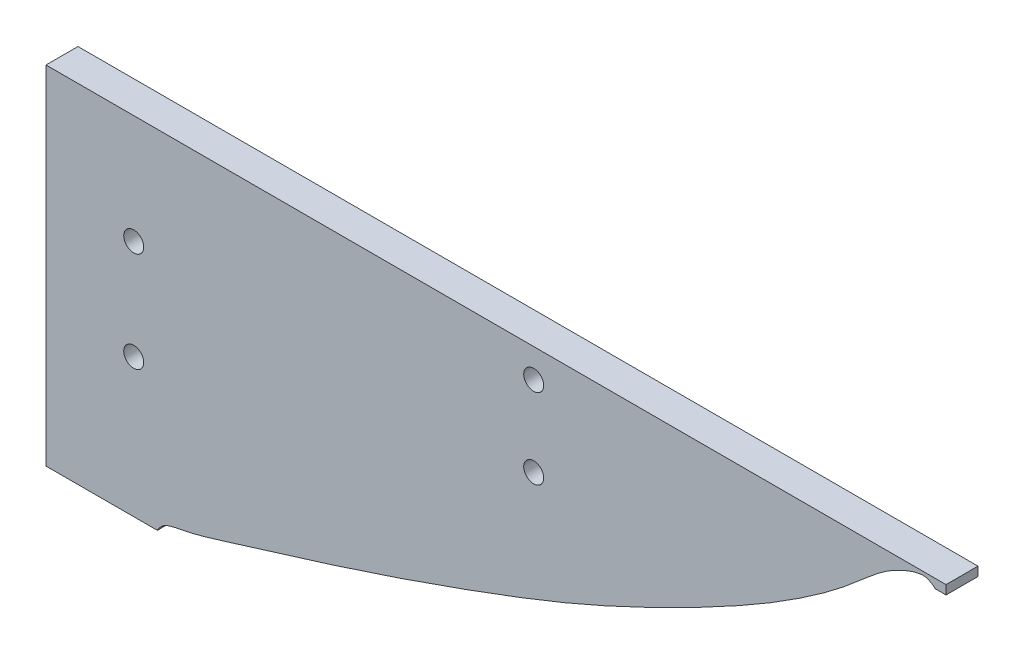
ISO-10303-21;
HEADER;
FILE_DESCRIPTION(('STEP AP214'),'2;1');
FILE_NAME('part.step','',(''),(''),'','','');
FILE_SCHEMA(('AUTOMOTIVE_DESIGN { 1 0 10303 214 1 1 1 1 }'));
ENDSEC;
DATA;
#1=APPLICATION_CONTEXT('core data for automotive mechanical design processes');
#2=APPLICATION_PROTOCOL_DEFINITION('international standard','automotive_design',2000,#1);
#3=PRODUCT_CONTEXT('',#1,'mechanical');
#4=PRODUCT('Part','Part','',(#3));
#5=PRODUCT_RELATED_PRODUCT_CATEGORY('part','',(#4));
#6=PRODUCT_DEFINITION_FORMATION('','',#4);
#7=PRODUCT_DEFINITION_CONTEXT('part definition',#1,'design');
#8=PRODUCT_DEFINITION('design','',#6,#7);
#9=PRODUCT_DEFINITION_SHAPE('','',#8);
#10=(LENGTH_UNIT() NAMED_UNIT(*) SI_UNIT(.MILLI.,.METRE.));
#11=(NAMED_UNIT(*) PLANE_ANGLE_UNIT() SI_UNIT($,.RADIAN.));
#12=(NAMED_UNIT(*) SI_UNIT($,.STERADIAN.) SOLID_ANGLE_UNIT());
#13=UNCERTAINTY_MEASURE_WITH_UNIT(LENGTH_MEASURE(1.E-05),#10,'distance_accuracy_value','');
#14=(GEOMETRIC_REPRESENTATION_CONTEXT(3) GLOBAL_UNCERTAINTY_ASSIGNED_CONTEXT((#13)) GLOBAL_UNIT_ASSIGNED_CONTEXT((#10,
#11,#12)) REPRESENTATION_CONTEXT('',''));
#15=CARTESIAN_POINT('',(0.,0.,0.));
#16=DIRECTION('',(0.,0.,1.));
#17=DIRECTION('',(1.,0.,0.));
#18=AXIS2_PLACEMENT_3D('',#15,#16,#17);
#19=CARTESIAN_POINT('',(7.2328128752797,-49.6204335958696,180.));
#20=DIRECTION('',(0.,0.,-1.));
#21=DIRECTION('',(-1.,0.,0.));
#22=AXIS2_PLACEMENT_3D('',#19,#20,#21);
#23=PLANE('',#22);
#24=CARTESIAN_POINT('',(-100.,-50.,180.));
#25=DIRECTION('',(0.,0.,-1.));
#26=DIRECTION('',(-1.,0.,0.));
#27=AXIS2_PLACEMENT_3D('',#24,#25,#26);
#28=CIRCLE('',#27,2.5);
#29=CARTESIAN_POINT('',(-102.5,-50.,180.));
#30=VERTEX_POINT('',#29);
#31=EDGE_CURVE('E242',#30,#30,#28,.F.);
#32=ORIENTED_EDGE('',*,*,#31,.F.);
#33=EDGE_LOOP('',(#32));
#34=FACE_BOUND('',#33,.T.);
#35=CARTESIAN_POINT('',(0.0705666698621599,-4.96037406111782,180.));
#36=DIRECTION('',(0.,0.,-1.));
#37=DIRECTION('',(-1.,0.,0.));
#38=AXIS2_PLACEMENT_3D('',#35,#36,#37);
#39=CIRCLE('',#38,2.5);
#40=CARTESIAN_POINT('',(-2.42943333013784,-4.96037406111782,180.));
#41=VERTEX_POINT('',#40);
#42=EDGE_CURVE('E238',#41,#41,#39,.F.);
#43=ORIENTED_EDGE('',*,*,#42,.F.);
#44=EDGE_LOOP('',(#43));
#45=FACE_BOUND('',#44,.T.);
#46=CARTESIAN_POINT('',(100.471154282561,0.,180.));
#47=CARTESIAN_POINT('',(100.408054989966,0.129786807460161,180.));
#48=CARTESIAN_POINT('',(100.304703862858,0.232658057293413,180.));
#49=CARTESIAN_POINT('',(100.076584896166,0.4071234126981,180.));
#50=CARTESIAN_POINT('',(99.955243878758,0.483033039062654,180.));
#51=CARTESIAN_POINT('',(99.5929613615913,0.713468513721508,180.));
#52=CARTESIAN_POINT('',(99.3565828385596,0.875395057017679,180.));
#53=CARTESIAN_POINT('',(98.9772983778677,1.07892448132871,180.));
#54=CARTESIAN_POINT('',(98.8489147478321,1.14113823304883,180.));
#55=CARTESIAN_POINT('',(98.5847551683284,1.24428486320763,180.));
#56=CARTESIAN_POINT('',(98.4486465612403,1.28426009300552,180.));
#57=CARTESIAN_POINT('',(98.1691424192041,1.3432330786417,180.));
#58=CARTESIAN_POINT('',(98.0254111419077,1.36218231291401,180.));
#59=CARTESIAN_POINT('',(97.7408322973029,1.38234815483863,180.));
#60=CARTESIAN_POINT('',(97.5987598937451,1.38390399845911,180.));
#61=CARTESIAN_POINT('',(97.1730026614788,1.37049810682273,180.));
#62=CARTESIAN_POINT('',(96.8890067855004,1.33789692513515,180.));
#63=CARTESIAN_POINT('',(96.3250278798241,1.24739222228476,180.));
#64=CARTESIAN_POINT('',(96.0468201136647,1.1907451766166,180.));
#65=CARTESIAN_POINT('',(95.2219441777138,0.991434019008236,180.));
#66=CARTESIAN_POINT('',(94.6850579931911,0.819295563819661,180.));
#67=CARTESIAN_POINT('',(93.6233729693174,0.438597972899097,180.));
#68=CARTESIAN_POINT('',(93.0989229397729,0.228987829659148,180.));
#69=CARTESIAN_POINT('',(92.0615489992294,-0.224962091450086,180.));
#70=CARTESIAN_POINT('',(91.5483920483561,-0.468842082657131,180.));
#71=CARTESIAN_POINT('',(90.0419946142921,-1.23849097037649,180.));
#72=CARTESIAN_POINT('',(89.0763803293101,-1.80641963291992,180.));
#73=CARTESIAN_POINT('',(86.2912598242061,-3.66869368024866,180.));
#74=CARTESIAN_POINT('',(84.5772601575338,-5.11270946639362,180.));
#75=CARTESIAN_POINT('',(82.0309498511078,-7.31375695590436,180.));
#76=CARTESIAN_POINT('',(81.1853587369474,-8.05191488591583,180.));
#77=CARTESIAN_POINT('',(79.4790942987835,-9.50728163414145,180.));
#78=CARTESIAN_POINT('',(78.6200516410328,-10.2267791545117,180.));
#79=CARTESIAN_POINT('',(76.0117437135278,-12.3420880266422,180.));
#80=CARTESIAN_POINT('',(74.2293380194322,-13.6920004727839,180.));
#81=CARTESIAN_POINT('',(70.6062901645955,-16.3111688816568,180.));
#82=CARTESIAN_POINT('',(68.7660169614089,-17.5809358441202,180.));
#83=CARTESIAN_POINT('',(65.0420901554389,-20.0603886775598,180.));
#84=CARTESIAN_POINT('',(63.1579344331396,-21.2693791218259,180.));
#85=CARTESIAN_POINT('',(59.3461673564658,-23.6271747232094,180.));
#86=CARTESIAN_POINT('',(57.4197963877762,-24.7760783433428,180.));
#87=CARTESIAN_POINT('',(53.5401373919744,-27.0222807082155,180.));
#88=CARTESIAN_POINT('',(51.5859874588674,-28.1203649533307,180.));
#89=CARTESIAN_POINT('',(47.657149873805,-30.2806552863859,180.));
#90=CARTESIAN_POINT('',(45.682458088426,-31.3425762915052,180.));
#91=CARTESIAN_POINT('',(39.7346969865076,-34.4813945359658,180.));
#92=CARTESIAN_POINT('',(35.7363617414028,-36.512375418543,180.));
#93=CARTESIAN_POINT('',(27.6908038011899,-40.4688908739496,180.));
#94=CARTESIAN_POINT('',(23.6441059135639,-42.3959913311034,180.));
#95=CARTESIAN_POINT('',(15.4881099440041,-46.1163042852202,180.));
#96=CARTESIAN_POINT('',(11.3753694528412,-47.9061545383723,180.));
#97=CARTESIAN_POINT('',(3.09025629771827,-51.3347126533668,180.));
#98=CARTESIAN_POINT('',(-1.08136488064514,-52.9747623150191,180.));
#99=CARTESIAN_POINT('',(-9.4609099422426,-56.1621465217994,180.));
#100=CARTESIAN_POINT('',(-13.6680302693022,-57.7125997116731,180.));
#101=CARTESIAN_POINT('',(-22.1012033469257,-60.7591772154073,180.));
#102=CARTESIAN_POINT('',(-26.3276307564415,-62.2542808069109,180.));
#103=CARTESIAN_POINT('',(-34.8042337083704,-65.1764711493172,180.));
#104=CARTESIAN_POINT('',(-39.0551043639137,-66.6023736970143,180.));
#105=CARTESIAN_POINT('',(-47.5789941904856,-69.3864604965142,180.));
#106=CARTESIAN_POINT('',(-51.8518111419422,-70.7450157431269,180.));
#107=CARTESIAN_POINT('',(-60.4085194334344,-73.4269103375464,180.));
#108=CARTESIAN_POINT('',(-64.6918750502564,-74.7518873893612,180.));
#109=CARTESIAN_POINT('',(-71.1184517978404,-76.73424365909,180.));
#110=CARTESIAN_POINT('',(-73.2612701975019,-77.3930178666579,180.));
#111=CARTESIAN_POINT('',(-76.4779836131185,-78.3730026260492,180.));
#112=CARTESIAN_POINT('',(-77.5506380800318,-78.6982948943509,180.));
#113=CARTESIAN_POINT('',(-79.6968114271097,-79.3460386209079,180.));
#114=CARTESIAN_POINT('',(-80.769513999295,-79.6714321673382,180.));
#115=CARTESIAN_POINT('',(-82.9205019863126,-80.3012880673793,180.));
#116=CARTESIAN_POINT('',(-83.9997156409739,-80.6023222019746,180.));
#117=CARTESIAN_POINT('',(-85.6319441459041,-81.0037912624357,180.));
#118=CARTESIAN_POINT('',(-86.1781706356875,-81.1295823225719,180.));
#119=CARTESIAN_POINT('',(-87.2752949983577,-81.3637157205127,180.));
#120=CARTESIAN_POINT('',(-87.827035995892,-81.4689087880605,180.));
#121=CARTESIAN_POINT('',(-88.9321122397858,-81.6733400261882,180.));
#122=CARTESIAN_POINT('',(-89.4843579407671,-81.7766479068202,180.));
#123=CARTESIAN_POINT('',(-90.3027247539308,-81.9689685893107,180.));
#124=CARTESIAN_POINT('',(-90.5738949335214,-82.0391219285039,180.));
#125=CARTESIAN_POINT('',(-91.1110894439908,-82.1986495706477,180.));
#126=CARTESIAN_POINT('',(-91.3770176069542,-82.2883830835406,180.));
#127=CARTESIAN_POINT('',(-91.7686340026207,-82.4501603713897,180.));
#128=CARTESIAN_POINT('',(-91.897952841729,-82.5086429714949,180.));
#129=CARTESIAN_POINT('',(-92.1534046565608,-82.6375081260353,180.));
#130=CARTESIAN_POINT('',(-92.2802782151257,-82.7084411698767,180.));
#131=CARTESIAN_POINT('',(-92.6438878550964,-82.9369543209383,180.));
#132=CARTESIAN_POINT('',(-92.8635563115861,-83.1144408750309,180.));
#133=CARTESIAN_POINT('',(-93.272689854053,-83.5028139409378,180.));
#134=CARTESIAN_POINT('',(-93.4598417659297,-83.7162584426666,180.));
#135=CARTESIAN_POINT('',(-93.7370652801272,-84.0403004337075,180.));
#136=CARTESIAN_POINT('',(-93.828685813648,-84.150040339622,180.));
#137=CARTESIAN_POINT('',(-93.9908942706409,-84.3839154654659,180.));
#138=CARTESIAN_POINT('',(-94.0605798141769,-84.5106716424073,180.));
#139=CARTESIAN_POINT('',(-94.0885523707614,-84.6514513068922,180.));
#140=B_SPLINE_CURVE_WITH_KNOTS('',3,(#46,#47,#48,#49,#50,#51,#52,#53,#54,#55,#56,#57,#58,#59,
#60,#61,#62,#63,#64,#65,#66,#67,#68,#69,#70,#71,#72,#73,#74,#75,#76,#77,#78,#79,#80,#81,#82,#83,
#84,#85,#86,#87,#88,#89,#90,#91,#92,#93,#94,#95,#96,#97,#98,#99,#100,#101,#102,#103,#104,#105,
#106,#107,#108,#109,#110,#111,#112,#113,#114,#115,#116,#117,#118,#119,#120,#121,#122,#123,#124,
#125,#126,#127,#128,#129,#130,#131,#132,#133,#134,#135,#136,#137,#138,#139),.UNSPECIFIED.,.F.,
.F.,(4,2,2,2,2,2,2,2,2,2,2,2,2,2,2,2,2,2,2,2,2,2,2,2,2,2,2,2,2,2,2,2,2,2,2,2,2,2,2,2,2,2,2,2,2,
2,4),(0.,0.001953125,0.00390625,0.00781249999999989,0.00976562499999978,0.0117187499999998,
0.0136718749999997,0.0156249999999997,0.0195312499999994,0.0234374999999993,0.0312499999999993,
0.0390624999999992,0.0468749999999991,0.0624999999999991,0.0937499999999991,0.109374999999999,
0.124999999999999,0.156249999999999,0.187499999999999,0.218749999999999,0.249999999999999,
0.281249999999999,0.312499999999999,0.375,0.4375,0.5,0.5625,0.625,0.6875,0.75,0.812500000000001,
0.875000000000001,0.906250000000001,0.921875000000001,0.937500000000001,0.953125000000001,
0.960937500000001,0.968750000000001,0.976562500000001,0.980468750000001,0.984375000000001,
0.986328125000001,0.988281250000001,0.992187500000001,0.99609375,0.998046875,1.),.UNSPECIFIED.);
#141=CARTESIAN_POINT('',(-94.0885523707615,-84.6514513068921,180.));
#142=VERTEX_POINT('',#141);
#143=CARTESIAN_POINT('',(100.471154282561,0.,180.));
#144=VERTEX_POINT('',#143);
#145=EDGE_CURVE('E196',#142,#144,#140,.F.);
#146=ORIENTED_EDGE('',*,*,#145,.T.);
#147=DIRECTION('',(1.,0.,0.));
#148=VECTOR('',#147,1.);
#149=CARTESIAN_POINT('',(100.471154282561,0.,180.));
#150=LINE('',#149,#148);
#151=CARTESIAN_POINT('',(103.229198754891,0.,180.));
#152=VERTEX_POINT('',#151);
#153=EDGE_CURVE('E90',#144,#152,#150,.T.);
#154=ORIENTED_EDGE('',*,*,#153,.T.);
#155=DIRECTION('',(0.,1.,0.));
#156=VECTOR('',#155,1.);
#157=CARTESIAN_POINT('',(103.229198754891,2.25600000000004,180.));
#158=LINE('',#157,#156);
#159=CARTESIAN_POINT('',(103.229198754891,2.25600000000004,180.));
#160=VERTEX_POINT('',#159);
#161=EDGE_CURVE('E103',#152,#160,#158,.T.);
#162=ORIENTED_EDGE('',*,*,#161,.T.);
#163=DIRECTION('',(-1.,0.,0.));
#164=VECTOR('',#163,1.);
#165=CARTESIAN_POINT('',(103.229198754891,2.25600000000004,180.));
#166=LINE('',#165,#164);
#167=CARTESIAN_POINT('',(-121.944823149517,2.25600000000001,180.));
#168=VERTEX_POINT('',#167);
#169=EDGE_CURVE('E97',#160,#168,#166,.T.);
#170=ORIENTED_EDGE('',*,*,#169,.T.);
#171=DIRECTION('',(0.,-1.,0.));
#172=VECTOR('',#171,1.);
#173=CARTESIAN_POINT('',(-121.944823149517,-84.6632227375932,180.));
#174=LINE('',#173,#172);
#175=CARTESIAN_POINT('',(-121.944823149517,-84.6632227375932,180.));
#176=VERTEX_POINT('',#175);
#177=EDGE_CURVE('E101',#168,#176,#174,.T.);
#178=ORIENTED_EDGE('',*,*,#177,.T.);
#179=CARTESIAN_POINT('',(-94.0885523707615,-84.6514513068921,180.));
#180=CARTESIAN_POINT('',(-103.373975083764,-84.6570848734655,180.));
#181=CARTESIAN_POINT('',(-112.659399026711,-84.6608656587816,180.));
#182=CARTESIAN_POINT('',(-121.944823149517,-84.6632227375932,180.));
#183=B_SPLINE_CURVE_WITH_KNOTS('',3,(#179,#180,#181,#182),.UNSPECIFIED.,.F.,.F.,(4,4),(0.,1.),.UNSPECIFIED.);
#184=EDGE_CURVE('E51',#176,#142,#183,.F.);
#185=ORIENTED_EDGE('',*,*,#184,.T.);
#186=EDGE_LOOP('',(#146,#154,#162,#170,#178,#185));
#187=FACE_BOUND('',#186,.T.);
#188=CARTESIAN_POINT('',(0.0705666698621599,-25.,180.));
#189=DIRECTION('',(0.,0.,-1.));
#190=DIRECTION('',(-1.,0.,0.));
#191=AXIS2_PLACEMENT_3D('',#188,#189,#190);
#192=CIRCLE('',#191,2.5);
#193=CARTESIAN_POINT('',(-2.42943333013784,-25.,180.));
#194=VERTEX_POINT('',#193);
#195=EDGE_CURVE('E239',#194,#194,#192,.F.);
#196=ORIENTED_EDGE('',*,*,#195,.F.);
#197=EDGE_LOOP('',(#196));
#198=FACE_BOUND('',#197,.T.);
#199=CARTESIAN_POINT('',(-100.,-25.,180.));
#200=DIRECTION('',(0.,0.,-1.));
#201=DIRECTION('',(-1.,0.,0.));
#202=AXIS2_PLACEMENT_3D('',#199,#200,#201);
#203=CIRCLE('',#202,2.5);
#204=CARTESIAN_POINT('',(-102.5,-25.,180.));
#205=VERTEX_POINT('',#204);
#206=EDGE_CURVE('E245',#205,#205,#203,.F.);
#207=ORIENTED_EDGE('',*,*,#206,.F.);
#208=EDGE_LOOP('',(#207));
#209=FACE_BOUND('',#208,.T.);
#210=ADVANCED_FACE('F30',(#34,#45,#187,#198,#209),#23,.F.);
#211=CARTESIAN_POINT('',(7.2328128752797,-49.6204335958696,172.));
#212=DIRECTION('',(0.,0.,-1.));
#213=DIRECTION('',(-1.,0.,0.));
#214=AXIS2_PLACEMENT_3D('',#211,#212,#213);
#215=PLANE('',#214);
#216=CARTESIAN_POINT('',(-100.,-50.,172.));
#217=DIRECTION('',(0.,0.,-1.));
#218=DIRECTION('',(-1.,0.,0.));
#219=AXIS2_PLACEMENT_3D('',#216,#217,#218);
#220=CIRCLE('',#219,2.5);
#221=CARTESIAN_POINT('',(-102.5,-50.,172.));
#222=VERTEX_POINT('',#221);
#223=EDGE_CURVE('E243',#222,#222,#220,.F.);
#224=ORIENTED_EDGE('',*,*,#223,.T.);
#225=EDGE_LOOP('',(#224));
#226=FACE_BOUND('',#225,.T.);
#227=CARTESIAN_POINT('',(0.0705666698621599,-4.96037406111782,172.));
#228=DIRECTION('',(0.,0.,-1.));
#229=DIRECTION('',(-1.,0.,0.));
#230=AXIS2_PLACEMENT_3D('',#227,#228,#229);
#231=CIRCLE('',#230,2.5);
#232=CARTESIAN_POINT('',(-2.42943333013784,-4.96037406111782,172.));
#233=VERTEX_POINT('',#232);
#234=EDGE_CURVE('E235',#233,#233,#231,.F.);
#235=ORIENTED_EDGE('',*,*,#234,.T.);
#236=EDGE_LOOP('',(#235));
#237=FACE_BOUND('',#236,.T.);
#238=CARTESIAN_POINT('',(-94.0885523707614,-84.6514513068922,172.));
#239=CARTESIAN_POINT('',(-94.0605798141769,-84.5106716424073,172.));
#240=CARTESIAN_POINT('',(-93.9908942706409,-84.3839154654659,172.));
#241=CARTESIAN_POINT('',(-93.828685813648,-84.150040339622,172.));
#242=CARTESIAN_POINT('',(-93.7370652801272,-84.0403004337075,172.));
#243=CARTESIAN_POINT('',(-93.4598417659297,-83.7162584426666,172.));
#244=CARTESIAN_POINT('',(-93.272689854053,-83.5028139409378,172.));
#245=CARTESIAN_POINT('',(-92.8635563115861,-83.1144408750309,172.));
#246=CARTESIAN_POINT('',(-92.6438878550964,-82.9369543209383,172.));
#247=CARTESIAN_POINT('',(-92.2802782151257,-82.7084411698767,172.));
#248=CARTESIAN_POINT('',(-92.1534046565608,-82.6375081260353,172.));
#249=CARTESIAN_POINT('',(-91.897952841729,-82.5086429714949,172.));
#250=CARTESIAN_POINT('',(-91.7686340026207,-82.4501603713897,172.));
#251=CARTESIAN_POINT('',(-91.3770176069542,-82.2883830835406,172.));
#252=CARTESIAN_POINT('',(-91.1110894439908,-82.1986495706477,172.));
#253=CARTESIAN_POINT('',(-90.5738949335214,-82.0391219285039,172.));
#254=CARTESIAN_POINT('',(-90.3027247539308,-81.9689685893107,172.));
#255=CARTESIAN_POINT('',(-89.4843579407671,-81.7766479068202,172.));
#256=CARTESIAN_POINT('',(-88.9321122397858,-81.6733400261882,172.));
#257=CARTESIAN_POINT('',(-87.827035995892,-81.4689087880605,172.));
#258=CARTESIAN_POINT('',(-87.2752949983577,-81.3637157205127,172.));
#259=CARTESIAN_POINT('',(-86.1781706356875,-81.1295823225719,172.));
#260=CARTESIAN_POINT('',(-85.6319441459041,-81.0037912624357,172.));
#261=CARTESIAN_POINT('',(-83.9997156409739,-80.6023222019746,172.));
#262=CARTESIAN_POINT('',(-82.9205019863126,-80.3012880673793,172.));
#263=CARTESIAN_POINT('',(-80.769513999295,-79.6714321673382,172.));
#264=CARTESIAN_POINT('',(-79.6968114271097,-79.3460386209079,172.));
#265=CARTESIAN_POINT('',(-77.5506380800318,-78.6982948943509,172.));
#266=CARTESIAN_POINT('',(-76.4779836131185,-78.3730026260492,172.));
#267=CARTESIAN_POINT('',(-73.2612701975019,-77.3930178666579,172.));
#268=CARTESIAN_POINT('',(-71.1184517978404,-76.73424365909,172.));
#269=CARTESIAN_POINT('',(-64.6918750502564,-74.7518873893612,172.));
#270=CARTESIAN_POINT('',(-60.4085194334344,-73.4269103375464,172.));
#271=CARTESIAN_POINT('',(-51.8518111419422,-70.7450157431269,172.));
#272=CARTESIAN_POINT('',(-47.5789941904856,-69.3864604965142,172.));
#273=CARTESIAN_POINT('',(-39.0551043639137,-66.6023736970143,172.));
#274=CARTESIAN_POINT('',(-34.8042337083704,-65.1764711493172,172.));
#275=CARTESIAN_POINT('',(-26.3276307564415,-62.2542808069109,172.));
#276=CARTESIAN_POINT('',(-22.1012033469257,-60.7591772154073,172.));
#277=CARTESIAN_POINT('',(-13.6680302693022,-57.7125997116731,172.));
#278=CARTESIAN_POINT('',(-9.4609099422426,-56.1621465217994,172.));
#279=CARTESIAN_POINT('',(-1.08136488064514,-52.9747623150191,172.));
#280=CARTESIAN_POINT('',(3.09025629771827,-51.3347126533668,172.));
#281=CARTESIAN_POINT('',(11.3753694528412,-47.9061545383723,172.));
#282=CARTESIAN_POINT('',(15.4881099440041,-46.1163042852202,172.));
#283=CARTESIAN_POINT('',(23.6441059135639,-42.3959913311034,172.));
#284=CARTESIAN_POINT('',(27.6908038011899,-40.4688908739496,172.));
#285=CARTESIAN_POINT('',(35.7363617414028,-36.512375418543,172.));
#286=CARTESIAN_POINT('',(39.7346969865076,-34.4813945359658,172.));
#287=CARTESIAN_POINT('',(45.682458088426,-31.3425762915052,172.));
#288=CARTESIAN_POINT('',(47.657149873805,-30.2806552863859,172.));
#289=CARTESIAN_POINT('',(51.5859874588674,-28.1203649533307,172.));
#290=CARTESIAN_POINT('',(53.5401373919744,-27.0222807082155,172.));
#291=CARTESIAN_POINT('',(57.4197963877762,-24.7760783433428,172.));
#292=CARTESIAN_POINT('',(59.3461673564658,-23.6271747232094,172.));
#293=CARTESIAN_POINT('',(63.1579344331396,-21.2693791218259,172.));
#294=CARTESIAN_POINT('',(65.0420901554389,-20.0603886775598,172.));
#295=CARTESIAN_POINT('',(68.7660169614089,-17.5809358441202,172.));
#296=CARTESIAN_POINT('',(70.6062901645955,-16.3111688816568,172.));
#297=CARTESIAN_POINT('',(74.2293380194322,-13.6920004727839,172.));
#298=CARTESIAN_POINT('',(76.0117437135278,-12.3420880266422,172.));
#299=CARTESIAN_POINT('',(78.6200516410328,-10.2267791545117,172.));
#300=CARTESIAN_POINT('',(79.4790942987835,-9.50728163414145,172.));
#301=CARTESIAN_POINT('',(81.1853587369474,-8.05191488591583,172.));
#302=CARTESIAN_POINT('',(82.0309498511078,-7.31375695590436,172.));
#303=CARTESIAN_POINT('',(84.5772601575338,-5.11270946639362,172.));
#304=CARTESIAN_POINT('',(86.2912598242061,-3.66869368024866,172.));
#305=CARTESIAN_POINT('',(89.0763803293101,-1.80641963291992,172.));
#306=CARTESIAN_POINT('',(90.0419946142921,-1.23849097037649,172.));
#307=CARTESIAN_POINT('',(91.5483920483561,-0.468842082657131,172.));
#308=CARTESIAN_POINT('',(92.0615489992294,-0.224962091450086,172.));
#309=CARTESIAN_POINT('',(93.0989229397729,0.228987829659148,172.));
#310=CARTESIAN_POINT('',(93.6233729693174,0.438597972899097,172.));
#311=CARTESIAN_POINT('',(94.6850579931911,0.819295563819661,172.));
#312=CARTESIAN_POINT('',(95.2219441777138,0.991434019008236,172.));
#313=CARTESIAN_POINT('',(96.0468201136647,1.1907451766166,172.));
#314=CARTESIAN_POINT('',(96.3250278798241,1.24739222228476,172.));
#315=CARTESIAN_POINT('',(96.8890067855004,1.33789692513515,172.));
#316=CARTESIAN_POINT('',(97.1730026614788,1.37049810682273,172.));
#317=CARTESIAN_POINT('',(97.5987598937451,1.38390399845911,172.));
#318=CARTESIAN_POINT('',(97.7408322973029,1.38234815483863,172.));
#319=CARTESIAN_POINT('',(98.0254111419077,1.36218231291401,172.));
#320=CARTESIAN_POINT('',(98.1691424192041,1.3432330786417,172.));
#321=CARTESIAN_POINT('',(98.4486465612403,1.28426009300552,172.));
#322=CARTESIAN_POINT('',(98.5847551683284,1.24428486320763,172.));
#323=CARTESIAN_POINT('',(98.8489147478321,1.14113823304883,172.));
#324=CARTESIAN_POINT('',(98.9772983778677,1.07892448132871,172.));
#325=CARTESIAN_POINT('',(99.3565828385596,0.875395057017679,172.));
#326=CARTESIAN_POINT('',(99.5929613615913,0.713468513721508,172.));
#327=CARTESIAN_POINT('',(99.955243878758,0.483033039062654,172.));
#328=CARTESIAN_POINT('',(100.076584896166,0.4071234126981,172.));
#329=CARTESIAN_POINT('',(100.304703862858,0.232658057293413,172.));
#330=CARTESIAN_POINT('',(100.408054989966,0.129786807460161,172.));
#331=CARTESIAN_POINT('',(100.471154282561,0.,172.));
#332=B_SPLINE_CURVE_WITH_KNOTS('',3,(#238,#239,#240,#241,#242,#243,#244,#245,#246,#247,#248,
#249,#250,#251,#252,#253,#254,#255,#256,#257,#258,#259,#260,#261,#262,#263,#264,#265,#266,#267,
#268,#269,#270,#271,#272,#273,#274,#275,#276,#277,#278,#279,#280,#281,#282,#283,#284,#285,#286,
#287,#288,#289,#290,#291,#292,#293,#294,#295,#296,#297,#298,#299,#300,#301,#302,#303,#304,#305,
#306,#307,#308,#309,#310,#311,#312,#313,#314,#315,#316,#317,#318,#319,#320,#321,#322,#323,#324,
#325,#326,#327,#328,#329,#330,#331),.UNSPECIFIED.,.F.,.F.,(4,2,2,2,2,2,2,2,2,2,2,2,2,2,2,2,2,2,
2,2,2,2,2,2,2,2,2,2,2,2,2,2,2,2,2,2,2,2,2,2,2,2,2,2,2,2,4),(0.,0.00195312499999989,
0.00390624999999978,0.00781249999999944,0.0117187499999992,0.0136718749999991,0.015624999999999,
0.0195312499999989,0.0234374999999988,0.0312499999999989,0.0390624999999989,0.046874999999999,
0.0624999999999991,0.0781249999999992,0.0937499999999993,0.124999999999999,0.187499999999999,
0.25,0.3125,0.375,0.4375,0.5,0.5625,0.625,0.687500000000001,0.718750000000001,0.750000000000001,
0.781250000000001,0.812500000000001,0.843750000000001,0.875000000000001,0.890625000000001,
0.906250000000001,0.937500000000001,0.953125000000001,0.960937500000001,0.968750000000001,
0.976562500000001,0.980468750000001,0.984375,0.986328125,0.98828125,0.990234375,0.9921875,
0.99609375,0.998046875,1.),.UNSPECIFIED.);
#333=CARTESIAN_POINT('',(-94.0885523707615,-84.6514513068921,172.));
#334=VERTEX_POINT('',#333);
#335=CARTESIAN_POINT('',(100.471154282561,0.,172.));
#336=VERTEX_POINT('',#335);
#337=EDGE_CURVE('E213',#334,#336,#332,.T.);
#338=ORIENTED_EDGE('',*,*,#337,.F.);
#339=CARTESIAN_POINT('',(-121.944823149517,-84.6632227375932,172.));
#340=CARTESIAN_POINT('',(-112.659399026711,-84.6608656587816,172.));
#341=CARTESIAN_POINT('',(-103.373975083764,-84.6570848734655,172.));
#342=CARTESIAN_POINT('',(-94.0885523707615,-84.6514513068921,172.));
#343=B_SPLINE_CURVE_WITH_KNOTS('',3,(#339,#340,#341,#342),.UNSPECIFIED.,.F.,.F.,(4,4),(0.,1.),.UNSPECIFIED.);
#344=CARTESIAN_POINT('',(-121.944823149517,-84.6632227375932,172.));
#345=VERTEX_POINT('',#344);
#346=EDGE_CURVE('E81',#345,#334,#343,.T.);
#347=ORIENTED_EDGE('',*,*,#346,.F.);
#348=DIRECTION('',(0.,-1.,0.));
#349=VECTOR('',#348,1.);
#350=CARTESIAN_POINT('',(-121.944823149517,-84.6632227375932,172.));
#351=LINE('',#350,#349);
#352=CARTESIAN_POINT('',(-121.944823149517,2.25600000000001,172.));
#353=VERTEX_POINT('',#352);
#354=EDGE_CURVE('E75',#353,#345,#351,.T.);
#355=ORIENTED_EDGE('',*,*,#354,.F.);
#356=DIRECTION('',(-1.,0.,0.));
#357=VECTOR('',#356,1.);
#358=CARTESIAN_POINT('',(103.229198754891,2.25600000000004,172.));
#359=LINE('',#358,#357);
#360=CARTESIAN_POINT('',(103.229198754891,2.25600000000004,172.));
#361=VERTEX_POINT('',#360);
#362=EDGE_CURVE('E111',#361,#353,#359,.T.);
#363=ORIENTED_EDGE('',*,*,#362,.F.);
#364=DIRECTION('',(0.,1.,0.));
#365=VECTOR('',#364,1.);
#366=CARTESIAN_POINT('',(103.229198754891,2.25600000000004,172.));
#367=LINE('',#366,#365);
#368=CARTESIAN_POINT('',(103.229198754891,0.,172.));
#369=VERTEX_POINT('',#368);
#370=EDGE_CURVE('E158',#369,#361,#367,.T.);
#371=ORIENTED_EDGE('',*,*,#370,.F.);
#372=DIRECTION('',(1.,0.,0.));
#373=VECTOR('',#372,1.);
#374=CARTESIAN_POINT('',(100.471154282561,0.,172.));
#375=LINE('',#374,#373);
#376=EDGE_CURVE('E163',#336,#369,#375,.T.);
#377=ORIENTED_EDGE('',*,*,#376,.F.);
#378=EDGE_LOOP('',(#338,#347,#355,#363,#371,#377));
#379=FACE_BOUND('',#378,.T.);
#380=CARTESIAN_POINT('',(0.0705666698621599,-25.,172.));
#381=DIRECTION('',(0.,0.,-1.));
#382=DIRECTION('',(-1.,0.,0.));
#383=AXIS2_PLACEMENT_3D('',#380,#381,#382);
#384=CIRCLE('',#383,2.5);
#385=CARTESIAN_POINT('',(-2.42943333013784,-25.,172.));
#386=VERTEX_POINT('',#385);
#387=EDGE_CURVE('E240',#386,#386,#384,.F.);
#388=ORIENTED_EDGE('',*,*,#387,.T.);
#389=EDGE_LOOP('',(#388));
#390=FACE_BOUND('',#389,.T.);
#391=CARTESIAN_POINT('',(-100.,-25.,172.));
#392=DIRECTION('',(0.,0.,-1.));
#393=DIRECTION('',(-1.,0.,0.));
#394=AXIS2_PLACEMENT_3D('',#391,#392,#393);
#395=CIRCLE('',#394,2.5);
#396=CARTESIAN_POINT('',(-102.5,-25.,172.));
#397=VERTEX_POINT('',#396);
#398=EDGE_CURVE('E36',#397,#397,#395,.F.);
#399=ORIENTED_EDGE('',*,*,#398,.T.);
#400=EDGE_LOOP('',(#399));
#401=FACE_BOUND('',#400,.T.);
#402=ADVANCED_FACE('F148',(#226,#237,#379,#390,#401),#215,.T.);
#403=CARTESIAN_POINT('',(-94.0885523707614,-84.6514513068922,180.));
#404=CARTESIAN_POINT('',(-94.0605798141769,-84.5106716424073,180.));
#405=CARTESIAN_POINT('',(-93.9908942706409,-84.3839154654659,180.));
#406=CARTESIAN_POINT('',(-93.828685813648,-84.150040339622,180.));
#407=CARTESIAN_POINT('',(-93.7370652801272,-84.0403004337075,180.));
#408=CARTESIAN_POINT('',(-93.4598417659297,-83.7162584426666,180.));
#409=CARTESIAN_POINT('',(-93.272689854053,-83.5028139409378,180.));
#410=CARTESIAN_POINT('',(-92.8635563115861,-83.1144408750309,180.));
#411=CARTESIAN_POINT('',(-92.6438878550964,-82.9369543209383,180.));
#412=CARTESIAN_POINT('',(-92.2802782151257,-82.7084411698767,180.));
#413=CARTESIAN_POINT('',(-92.1534046565608,-82.6375081260353,180.));
#414=CARTESIAN_POINT('',(-91.897952841729,-82.5086429714949,180.));
#415=CARTESIAN_POINT('',(-91.7686340026207,-82.4501603713897,180.));
#416=CARTESIAN_POINT('',(-91.3770176069542,-82.2883830835406,180.));
#417=CARTESIAN_POINT('',(-91.1110894439908,-82.1986495706477,180.));
#418=CARTESIAN_POINT('',(-90.5738949335214,-82.0391219285039,180.));
#419=CARTESIAN_POINT('',(-90.3027247539308,-81.9689685893107,180.));
#420=CARTESIAN_POINT('',(-89.4843579407671,-81.7766479068202,180.));
#421=CARTESIAN_POINT('',(-88.9321122397858,-81.6733400261882,180.));
#422=CARTESIAN_POINT('',(-87.827035995892,-81.4689087880605,180.));
#423=CARTESIAN_POINT('',(-87.2752949983577,-81.3637157205127,180.));
#424=CARTESIAN_POINT('',(-86.1781706356875,-81.1295823225719,180.));
#425=CARTESIAN_POINT('',(-85.6319441459041,-81.0037912624357,180.));
#426=CARTESIAN_POINT('',(-83.9997156409739,-80.6023222019746,180.));
#427=CARTESIAN_POINT('',(-82.9205019863126,-80.3012880673793,180.));
#428=CARTESIAN_POINT('',(-80.769513999295,-79.6714321673382,180.));
#429=CARTESIAN_POINT('',(-79.6968114271097,-79.3460386209079,180.));
#430=CARTESIAN_POINT('',(-77.5506380800318,-78.6982948943509,180.));
#431=CARTESIAN_POINT('',(-76.4779836131185,-78.3730026260492,180.));
#432=CARTESIAN_POINT('',(-73.2612701975019,-77.3930178666579,180.));
#433=CARTESIAN_POINT('',(-71.1184517978404,-76.73424365909,180.));
#434=CARTESIAN_POINT('',(-64.6918750502564,-74.7518873893612,180.));
#435=CARTESIAN_POINT('',(-60.4085194334344,-73.4269103375464,180.));
#436=CARTESIAN_POINT('',(-51.8518111419422,-70.7450157431269,180.));
#437=CARTESIAN_POINT('',(-47.5789941904856,-69.3864604965142,180.));
#438=CARTESIAN_POINT('',(-39.0551043639137,-66.6023736970143,180.));
#439=CARTESIAN_POINT('',(-34.8042337083704,-65.1764711493172,180.));
#440=CARTESIAN_POINT('',(-26.3276307564415,-62.2542808069109,180.));
#441=CARTESIAN_POINT('',(-22.1012033469257,-60.7591772154073,180.));
#442=CARTESIAN_POINT('',(-13.6680302693022,-57.7125997116731,180.));
#443=CARTESIAN_POINT('',(-9.4609099422426,-56.1621465217994,180.));
#444=CARTESIAN_POINT('',(-1.08136488064514,-52.9747623150191,180.));
#445=CARTESIAN_POINT('',(3.09025629771827,-51.3347126533668,180.));
#446=CARTESIAN_POINT('',(11.3753694528412,-47.9061545383723,180.));
#447=CARTESIAN_POINT('',(15.4881099440041,-46.1163042852202,180.));
#448=CARTESIAN_POINT('',(23.6441059135639,-42.3959913311034,180.));
#449=CARTESIAN_POINT('',(27.6908038011899,-40.4688908739496,180.));
#450=CARTESIAN_POINT('',(35.7363617414028,-36.512375418543,180.));
#451=CARTESIAN_POINT('',(39.7346969865076,-34.4813945359658,180.));
#452=CARTESIAN_POINT('',(45.682458088426,-31.3425762915052,180.));
#453=CARTESIAN_POINT('',(47.657149873805,-30.2806552863859,180.));
#454=CARTESIAN_POINT('',(51.5859874588674,-28.1203649533307,180.));
#455=CARTESIAN_POINT('',(53.5401373919744,-27.0222807082155,180.));
#456=CARTESIAN_POINT('',(57.4197963877762,-24.7760783433428,180.));
#457=CARTESIAN_POINT('',(59.3461673564658,-23.6271747232094,180.));
#458=CARTESIAN_POINT('',(63.1579344331396,-21.2693791218259,180.));
#459=CARTESIAN_POINT('',(65.0420901554389,-20.0603886775598,180.));
#460=CARTESIAN_POINT('',(68.7660169614089,-17.5809358441202,180.));
#461=CARTESIAN_POINT('',(70.6062901645955,-16.3111688816568,180.));
#462=CARTESIAN_POINT('',(74.2293380194322,-13.6920004727839,180.));
#463=CARTESIAN_POINT('',(76.0117437135278,-12.3420880266422,180.));
#464=CARTESIAN_POINT('',(78.6200516410328,-10.2267791545117,180.));
#465=CARTESIAN_POINT('',(79.4790942987835,-9.50728163414145,180.));
#466=CARTESIAN_POINT('',(81.1853587369474,-8.05191488591583,180.));
#467=CARTESIAN_POINT('',(82.0309498511078,-7.31375695590436,180.));
#468=CARTESIAN_POINT('',(84.5772601575338,-5.11270946639362,180.));
#469=CARTESIAN_POINT('',(86.2912598242061,-3.66869368024866,180.));
#470=CARTESIAN_POINT('',(89.0763803293101,-1.80641963291992,180.));
#471=CARTESIAN_POINT('',(90.0419946142921,-1.23849097037649,180.));
#472=CARTESIAN_POINT('',(91.5483920483561,-0.468842082657131,180.));
#473=CARTESIAN_POINT('',(92.0615489992294,-0.224962091450086,180.));
#474=CARTESIAN_POINT('',(93.0989229397729,0.228987829659148,180.));
#475=CARTESIAN_POINT('',(93.6233729693174,0.438597972899097,180.));
#476=CARTESIAN_POINT('',(94.6850579931911,0.819295563819661,180.));
#477=CARTESIAN_POINT('',(95.2219441777138,0.991434019008236,180.));
#478=CARTESIAN_POINT('',(96.0468201136647,1.1907451766166,180.));
#479=CARTESIAN_POINT('',(96.3250278798241,1.24739222228476,180.));
#480=CARTESIAN_POINT('',(96.8890067855004,1.33789692513515,180.));
#481=CARTESIAN_POINT('',(97.1730026614788,1.37049810682273,180.));
#482=CARTESIAN_POINT('',(97.5987598937451,1.38390399845911,180.));
#483=CARTESIAN_POINT('',(97.7408322973029,1.38234815483863,180.));
#484=CARTESIAN_POINT('',(98.0254111419077,1.36218231291401,180.));
#485=CARTESIAN_POINT('',(98.1691424192041,1.3432330786417,180.));
#486=CARTESIAN_POINT('',(98.4486465612403,1.28426009300552,180.));
#487=CARTESIAN_POINT('',(98.5847551683284,1.24428486320763,180.));
#488=CARTESIAN_POINT('',(98.8489147478321,1.14113823304883,180.));
#489=CARTESIAN_POINT('',(98.9772983778677,1.07892448132871,180.));
#490=CARTESIAN_POINT('',(99.3565828385596,0.875395057017679,180.));
#491=CARTESIAN_POINT('',(99.5929613615913,0.713468513721508,180.));
#492=CARTESIAN_POINT('',(99.955243878758,0.483033039062654,180.));
#493=CARTESIAN_POINT('',(100.076584896166,0.4071234126981,180.));
#494=CARTESIAN_POINT('',(100.304703862858,0.232658057293413,180.));
#495=CARTESIAN_POINT('',(100.408054989966,0.129786807460161,180.));
#496=CARTESIAN_POINT('',(100.471154282561,0.,180.));
#497=B_SPLINE_CURVE_WITH_KNOTS('',3,(#403,#404,#405,#406,#407,#408,#409,#410,#411,#412,#413,
#414,#415,#416,#417,#418,#419,#420,#421,#422,#423,#424,#425,#426,#427,#428,#429,#430,#431,#432,
#433,#434,#435,#436,#437,#438,#439,#440,#441,#442,#443,#444,#445,#446,#447,#448,#449,#450,#451,
#452,#453,#454,#455,#456,#457,#458,#459,#460,#461,#462,#463,#464,#465,#466,#467,#468,#469,#470,
#471,#472,#473,#474,#475,#476,#477,#478,#479,#480,#481,#482,#483,#484,#485,#486,#487,#488,#489,
#490,#491,#492,#493,#494,#495,#496),.UNSPECIFIED.,.F.,.F.,(4,2,2,2,2,2,2,2,2,2,2,2,2,2,2,2,2,2,
2,2,2,2,2,2,2,2,2,2,2,2,2,2,2,2,2,2,2,2,2,2,2,2,2,2,2,2,4),(0.,0.00195312499999989,
0.00390624999999978,0.00781249999999944,0.0117187499999992,0.0136718749999991,0.015624999999999,
0.0195312499999989,0.0234374999999988,0.0312499999999989,0.0390624999999989,0.046874999999999,
0.0624999999999991,0.0781249999999992,0.0937499999999993,0.124999999999999,0.187499999999999,
0.25,0.3125,0.375,0.4375,0.5,0.5625,0.625,0.687500000000001,0.718750000000001,0.750000000000001,
0.781250000000001,0.812500000000001,0.843750000000001,0.875000000000001,0.890625000000001,
0.906250000000001,0.937500000000001,0.953125000000001,0.960937500000001,0.968750000000001,
0.976562500000001,0.980468750000001,0.984375,0.986328125,0.98828125,0.990234375,0.9921875,
0.99609375,0.998046875,1.),.UNSPECIFIED.);
#498=DIRECTION('',(0.,0.,-1.));
#499=VECTOR('',#498,1.);
#500=SURFACE_OF_LINEAR_EXTRUSION('',#497,#499);
#501=ORIENTED_EDGE('',*,*,#337,.T.);
#502=DIRECTION('',(0.,0.,-1.));
#503=VECTOR('',#502,1.);
#504=CARTESIAN_POINT('',(100.471154282561,0.,180.));
#505=LINE('',#504,#503);
#506=EDGE_CURVE('E11',#144,#336,#505,.T.);
#507=ORIENTED_EDGE('',*,*,#506,.F.);
#508=ORIENTED_EDGE('',*,*,#145,.F.);
#509=DIRECTION('',(0.,0.,-1.));
#510=VECTOR('',#509,1.);
#511=CARTESIAN_POINT('',(-94.0885523707615,-84.6514513068921,180.));
#512=LINE('',#511,#510);
#513=EDGE_CURVE('E117',#142,#334,#512,.T.);
#514=ORIENTED_EDGE('',*,*,#513,.T.);
#515=EDGE_LOOP('',(#501,#507,#508,#514));
#516=FACE_BOUND('',#515,.T.);
#517=ADVANCED_FACE('F32',(#516),#500,.F.);
#518=CARTESIAN_POINT('',(100.471154282561,0.,180.));
#519=DIRECTION('',(0.,1.,0.));
#520=DIRECTION('',(-1.,0.,0.));
#521=AXIS2_PLACEMENT_3D('',#518,#519,#520);
#522=PLANE('',#521);
#523=ORIENTED_EDGE('',*,*,#376,.T.);
#524=DIRECTION('',(0.,0.,-1.));
#525=VECTOR('',#524,1.);
#526=CARTESIAN_POINT('',(103.229198754891,0.,180.));
#527=LINE('',#526,#525);
#528=EDGE_CURVE('E42',#152,#369,#527,.T.);
#529=ORIENTED_EDGE('',*,*,#528,.F.);
#530=ORIENTED_EDGE('',*,*,#153,.F.);
#531=ORIENTED_EDGE('',*,*,#506,.T.);
#532=EDGE_LOOP('',(#523,#529,#530,#531));
#533=FACE_BOUND('',#532,.T.);
#534=ADVANCED_FACE('F338',(#533),#522,.F.);
#535=CARTESIAN_POINT('',(103.229198754891,2.25600000000004,180.));
#536=DIRECTION('',(-1.,0.,0.));
#537=DIRECTION('',(0.,-1.,0.));
#538=AXIS2_PLACEMENT_3D('',#535,#536,#537);
#539=PLANE('',#538);
#540=ORIENTED_EDGE('',*,*,#370,.T.);
#541=DIRECTION('',(0.,0.,-1.));
#542=VECTOR('',#541,1.);
#543=CARTESIAN_POINT('',(103.229198754891,2.25600000000004,180.));
#544=LINE('',#543,#542);
#545=EDGE_CURVE('E112',#160,#361,#544,.T.);
#546=ORIENTED_EDGE('',*,*,#545,.F.);
#547=ORIENTED_EDGE('',*,*,#161,.F.);
#548=ORIENTED_EDGE('',*,*,#528,.T.);
#549=EDGE_LOOP('',(#540,#546,#547,#548));
#550=FACE_BOUND('',#549,.T.);
#551=ADVANCED_FACE('F330',(#550),#539,.F.);
#552=CARTESIAN_POINT('',(103.229198754891,2.25600000000004,180.));
#553=DIRECTION('',(0.,-1.,0.));
#554=DIRECTION('',(1.,0.,0.));
#555=AXIS2_PLACEMENT_3D('',#552,#553,#554);
#556=PLANE('',#555);
#557=ORIENTED_EDGE('',*,*,#362,.T.);
#558=DIRECTION('',(0.,0.,-1.));
#559=VECTOR('',#558,1.);
#560=CARTESIAN_POINT('',(-121.944823149517,2.25600000000001,180.));
#561=LINE('',#560,#559);
#562=EDGE_CURVE('E108',#168,#353,#561,.T.);
#563=ORIENTED_EDGE('',*,*,#562,.F.);
#564=ORIENTED_EDGE('',*,*,#169,.F.);
#565=ORIENTED_EDGE('',*,*,#545,.T.);
#566=EDGE_LOOP('',(#557,#563,#564,#565));
#567=FACE_BOUND('',#566,.T.);
#568=ADVANCED_FACE('F109',(#567),#556,.F.);
#569=CARTESIAN_POINT('',(-121.944823149517,-84.6632227375932,180.));
#570=DIRECTION('',(1.,0.,0.));
#571=DIRECTION('',(0.,1.,0.));
#572=AXIS2_PLACEMENT_3D('',#569,#570,#571);
#573=PLANE('',#572);
#574=ORIENTED_EDGE('',*,*,#354,.T.);
#575=DIRECTION('',(0.,0.,-1.));
#576=VECTOR('',#575,1.);
#577=CARTESIAN_POINT('',(-121.944823149517,-84.6632227375932,180.));
#578=LINE('',#577,#576);
#579=EDGE_CURVE('E113',#176,#345,#578,.T.);
#580=ORIENTED_EDGE('',*,*,#579,.F.);
#581=ORIENTED_EDGE('',*,*,#177,.F.);
#582=ORIENTED_EDGE('',*,*,#562,.T.);
#583=EDGE_LOOP('',(#574,#580,#581,#582));
#584=FACE_BOUND('',#583,.T.);
#585=ADVANCED_FACE('F115',(#584),#573,.F.);
#586=CARTESIAN_POINT('',(-121.944823149517,-84.6632227375932,180.));
#587=CARTESIAN_POINT('',(-112.659399026711,-84.6608656587816,180.));
#588=CARTESIAN_POINT('',(-103.373975083764,-84.6570848734655,180.));
#589=CARTESIAN_POINT('',(-94.0885523707615,-84.6514513068921,180.));
#590=B_SPLINE_CURVE_WITH_KNOTS('',3,(#586,#587,#588,#589),.UNSPECIFIED.,.F.,.F.,(4,4),(0.,1.),.UNSPECIFIED.);
#591=DIRECTION('',(0.,0.,-1.));
#592=VECTOR('',#591,1.);
#593=SURFACE_OF_LINEAR_EXTRUSION('',#590,#592);
#594=ORIENTED_EDGE('',*,*,#346,.T.);
#595=ORIENTED_EDGE('',*,*,#513,.F.);
#596=ORIENTED_EDGE('',*,*,#184,.F.);
#597=ORIENTED_EDGE('',*,*,#579,.T.);
#598=EDGE_LOOP('',(#594,#595,#596,#597));
#599=FACE_BOUND('',#598,.T.);
#600=ADVANCED_FACE('F136',(#599),#593,.F.);
#601=CARTESIAN_POINT('',(0.0705666698621599,-4.96037406111782,308.));
#602=DIRECTION('',(0.,0.,-1.));
#603=DIRECTION('',(-1.,0.,0.));
#604=AXIS2_PLACEMENT_3D('',#601,#602,#603);
#605=CYLINDRICAL_SURFACE('',#604,2.5);
#606=ORIENTED_EDGE('',*,*,#234,.F.);
#607=EDGE_LOOP('',(#606));
#608=FACE_BOUND('',#607,.T.);
#609=ORIENTED_EDGE('',*,*,#42,.T.);
#610=EDGE_LOOP('',(#609));
#611=FACE_BOUND('',#610,.T.);
#612=ADVANCED_FACE('F147',(#608,#611),#605,.F.);
#613=CARTESIAN_POINT('',(0.0705666698621599,-25.,308.));
#614=DIRECTION('',(0.,0.,-1.));
#615=DIRECTION('',(-1.,0.,0.));
#616=AXIS2_PLACEMENT_3D('',#613,#614,#615);
#617=CYLINDRICAL_SURFACE('',#616,2.5);
#618=ORIENTED_EDGE('',*,*,#387,.F.);
#619=EDGE_LOOP('',(#618));
#620=FACE_BOUND('',#619,.T.);
#621=ORIENTED_EDGE('',*,*,#195,.T.);
#622=EDGE_LOOP('',(#621));
#623=FACE_BOUND('',#622,.T.);
#624=ADVANCED_FACE('F269',(#620,#623),#617,.F.);
#625=CARTESIAN_POINT('',(-100.,-50.,308.));
#626=DIRECTION('',(0.,0.,-1.));
#627=DIRECTION('',(-1.,0.,0.));
#628=AXIS2_PLACEMENT_3D('',#625,#626,#627);
#629=CYLINDRICAL_SURFACE('',#628,2.5);
#630=ORIENTED_EDGE('',*,*,#223,.F.);
#631=EDGE_LOOP('',(#630));
#632=FACE_BOUND('',#631,.T.);
#633=ORIENTED_EDGE('',*,*,#31,.T.);
#634=EDGE_LOOP('',(#633));
#635=FACE_BOUND('',#634,.T.);
#636=ADVANCED_FACE('F274',(#632,#635),#629,.F.);
#637=CARTESIAN_POINT('',(-100.,-25.,308.));
#638=DIRECTION('',(0.,0.,-1.));
#639=DIRECTION('',(-1.,0.,0.));
#640=AXIS2_PLACEMENT_3D('',#637,#638,#639);
#641=CYLINDRICAL_SURFACE('',#640,2.5);
#642=ORIENTED_EDGE('',*,*,#398,.F.);
#643=EDGE_LOOP('',(#642));
#644=FACE_BOUND('',#643,.T.);
#645=ORIENTED_EDGE('',*,*,#206,.T.);
#646=EDGE_LOOP('',(#645));
#647=FACE_BOUND('',#646,.T.);
#648=ADVANCED_FACE('F284',(#644,#647),#641,.F.);
#649=CLOSED_SHELL('',(#210,#402,#517,#534,#551,#568,#585,#600,#612,#624,#636,#648));
#650=MANIFOLD_SOLID_BREP('B2',#649);
#651=ADVANCED_BREP_SHAPE_REPRESENTATION('',(#18,#650),#14);
#652=SHAPE_DEFINITION_REPRESENTATION(#9,#651);
ENDSEC;
END-ISO-10303-21;
